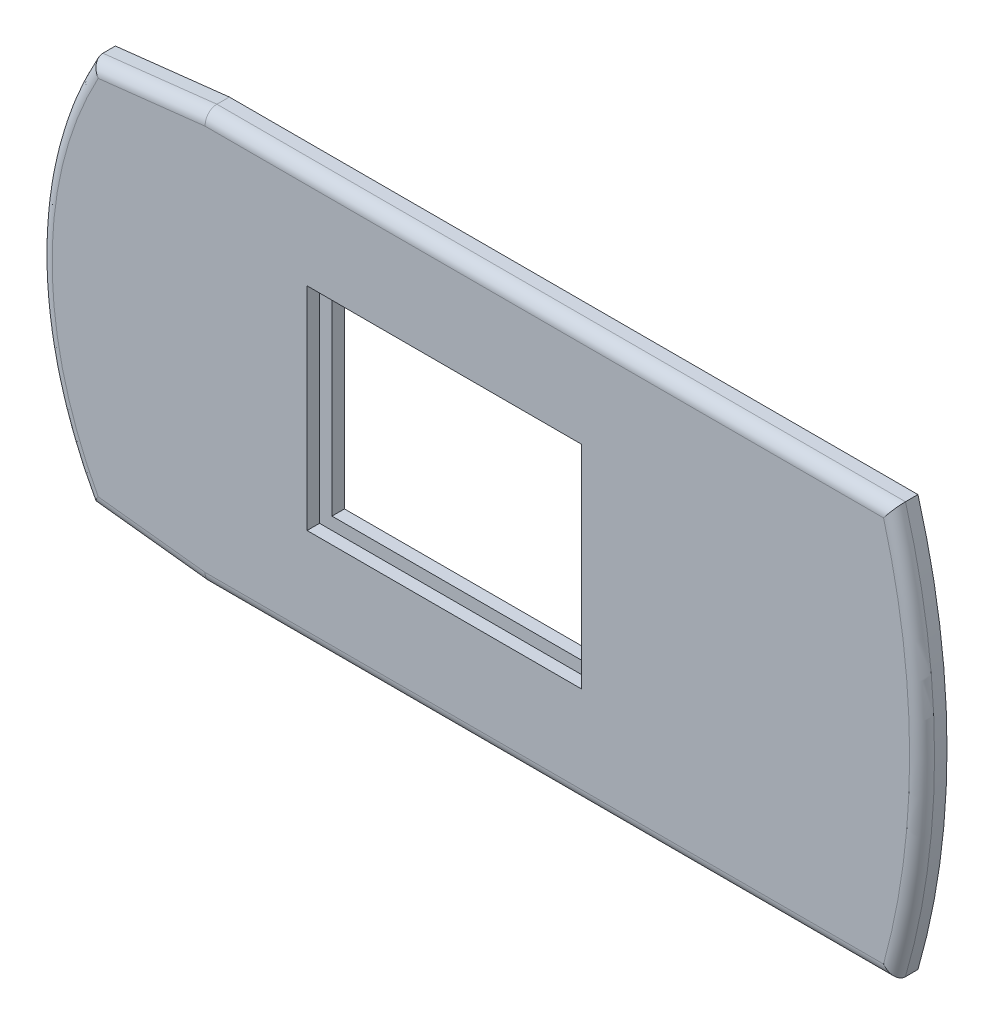
ISO-10303-21;
HEADER;
FILE_DESCRIPTION(('STEP AP214'),'2;1');
FILE_NAME('part.step','',(''),(''),'','','');
FILE_SCHEMA(('AUTOMOTIVE_DESIGN { 1 0 10303 214 1 1 1 1 }'));
ENDSEC;
DATA;
#1=APPLICATION_CONTEXT('core data for automotive mechanical design processes');
#2=APPLICATION_PROTOCOL_DEFINITION('international standard','automotive_design',2000,#1);
#3=PRODUCT_CONTEXT('',#1,'mechanical');
#4=PRODUCT('Part','Part','',(#3));
#5=PRODUCT_RELATED_PRODUCT_CATEGORY('part','',(#4));
#6=PRODUCT_DEFINITION_FORMATION('','',#4);
#7=PRODUCT_DEFINITION_CONTEXT('part definition',#1,'design');
#8=PRODUCT_DEFINITION('design','',#6,#7);
#9=PRODUCT_DEFINITION_SHAPE('','',#8);
#10=(LENGTH_UNIT() NAMED_UNIT(*) SI_UNIT(.MILLI.,.METRE.));
#11=(NAMED_UNIT(*) PLANE_ANGLE_UNIT() SI_UNIT($,.RADIAN.));
#12=(NAMED_UNIT(*) SI_UNIT($,.STERADIAN.) SOLID_ANGLE_UNIT());
#13=UNCERTAINTY_MEASURE_WITH_UNIT(LENGTH_MEASURE(1.E-05),#10,'distance_accuracy_value','');
#14=(GEOMETRIC_REPRESENTATION_CONTEXT(3) GLOBAL_UNCERTAINTY_ASSIGNED_CONTEXT((#13)) GLOBAL_UNIT_ASSIGNED_CONTEXT((#10,
#11,#12)) REPRESENTATION_CONTEXT('',''));
#15=CARTESIAN_POINT('',(0.,0.,0.));
#16=DIRECTION('',(0.,0.,1.));
#17=DIRECTION('',(1.,0.,0.));
#18=AXIS2_PLACEMENT_3D('',#15,#16,#17);
#19=CARTESIAN_POINT('',(0.,12.8449815277263,10.));
#20=DIRECTION('',(0.,1.,0.));
#21=DIRECTION('',(-1.,0.,0.));
#22=AXIS2_PLACEMENT_3D('',#19,#20,#21);
#23=PLANE('',#22);
#24=DIRECTION('',(0.,0.,-1.));
#25=VECTOR('',#24,1.);
#26=CARTESIAN_POINT('',(-107.169243918135,12.8449815277263,5.));
#27=LINE('',#26,#25);
#28=CARTESIAN_POINT('',(-107.169243918135,12.8449815277263,5.));
#29=VERTEX_POINT('',#28);
#30=CARTESIAN_POINT('',(-107.169243918135,12.8449815277263,0.));
#31=VERTEX_POINT('',#30);
#32=EDGE_CURVE('E716',#29,#31,#27,.T.);
#33=ORIENTED_EDGE('',*,*,#32,.T.);
#34=DIRECTION('',(1.,0.,0.));
#35=VECTOR('',#34,1.);
#36=CARTESIAN_POINT('',(0.,12.8449815277263,0.));
#37=LINE('',#36,#35);
#38=CARTESIAN_POINT('',(-7.16924391813531,12.8449815277263,0.));
#39=VERTEX_POINT('',#38);
#40=EDGE_CURVE('E726',#31,#39,#37,.T.);
#41=ORIENTED_EDGE('',*,*,#40,.T.);
#42=DIRECTION('',(0.,0.,-1.));
#43=VECTOR('',#42,1.);
#44=CARTESIAN_POINT('',(-7.16924391813531,12.8449815277263,5.));
#45=LINE('',#44,#43);
#46=CARTESIAN_POINT('',(-7.16924391813531,12.8449815277263,5.));
#47=VERTEX_POINT('',#46);
#48=EDGE_CURVE('E329',#47,#39,#45,.T.);
#49=ORIENTED_EDGE('',*,*,#48,.F.);
#50=DIRECTION('',(1.,0.,0.));
#51=VECTOR('',#50,1.);
#52=CARTESIAN_POINT('',(0.,12.8449815277263,5.));
#53=LINE('',#52,#51);
#54=CARTESIAN_POINT('',(-2.16924391813533,12.8449815277263,5.));
#55=VERTEX_POINT('',#54);
#56=EDGE_CURVE('E257',#47,#55,#53,.T.);
#57=ORIENTED_EDGE('',*,*,#56,.T.);
#58=DIRECTION('',(0.,0.,-1.));
#59=VECTOR('',#58,1.);
#60=CARTESIAN_POINT('',(-2.16924391813533,12.8449815277263,10.));
#61=LINE('',#60,#59);
#62=CARTESIAN_POINT('',(-2.16924391813533,12.8449815277263,10.));
#63=VERTEX_POINT('',#62);
#64=EDGE_CURVE('E256',#63,#55,#61,.T.);
#65=ORIENTED_EDGE('',*,*,#64,.F.);
#66=DIRECTION('',(1.,0.,0.));
#67=VECTOR('',#66,1.);
#68=CARTESIAN_POINT('',(0.,12.8449815277263,10.));
#69=LINE('',#68,#67);
#70=CARTESIAN_POINT('',(-112.169243918135,12.8449815277263,10.));
#71=VERTEX_POINT('',#70);
#72=EDGE_CURVE('E743',#71,#63,#69,.T.);
#73=ORIENTED_EDGE('',*,*,#72,.F.);
#74=DIRECTION('',(0.,0.,-1.));
#75=VECTOR('',#74,1.);
#76=CARTESIAN_POINT('',(-112.169243918135,12.8449815277263,10.));
#77=LINE('',#76,#75);
#78=CARTESIAN_POINT('',(-112.169243918135,12.8449815277263,5.));
#79=VERTEX_POINT('',#78);
#80=EDGE_CURVE('E269',#71,#79,#77,.T.);
#81=ORIENTED_EDGE('',*,*,#80,.T.);
#82=EDGE_CURVE('E728',#79,#29,#53,.T.);
#83=ORIENTED_EDGE('',*,*,#82,.T.);
#84=EDGE_LOOP('',(#33,#41,#49,#57,#65,#73,#81,#83));
#85=FACE_BOUND('',#84,.T.);
#86=ADVANCED_FACE('F113',(#85),#23,.F.);
#87=CARTESIAN_POINT('',(-162.842918543589,-29.6550184722738,10.));
#88=DIRECTION('',(0.,0.,1.));
#89=DIRECTION('',(1.,0.,0.));
#90=AXIS2_PLACEMENT_3D('',#87,#88,#89);
#91=PLANE('',#90);
#92=DIRECTION('',(0.993731316158802,0.111794773067865,0.));
#93=VECTOR('',#92,1.);
#94=CARTESIAN_POINT('',(-171.330387782105,45.7891525367555,10.));
#95=LINE('',#94,#93);
#96=CARTESIAN_POINT('',(-153.056352306809,47.8449815277263,10.));
#97=VERTEX_POINT('',#96);
#98=CARTESIAN_POINT('',(-195.950945707795,43.0193397701153,10.));
#99=VERTEX_POINT('',#98);
#100=EDGE_CURVE('E310',#97,#99,#95,.F.);
#101=ORIENTED_EDGE('',*,*,#100,.T.);
#102=CARTESIAN_POINT('',(-62.3678470078131,-29.6550184722737,10.));
#103=DIRECTION('',(0.,0.,1.));
#104=DIRECTION('',(1.,0.,0.));
#105=AXIS2_PLACEMENT_3D('',#102,#103,#104);
#106=CIRCLE('',#105,152.072372915767);
#107=CARTESIAN_POINT('',(-195.950945707795,-102.329376714663,10.));
#108=VERTEX_POINT('',#107);
#109=EDGE_CURVE('E312',#99,#108,#106,.T.);
#110=ORIENTED_EDGE('',*,*,#109,.T.);
#111=DIRECTION('',(0.993731316158802,-0.111794773067865,0.));
#112=VECTOR('',#111,1.);
#113=CARTESIAN_POINT('',(-152.777744136089,-107.18636189148,10.));
#114=LINE('',#113,#112);
#115=CARTESIAN_POINT('',(-153.056352306809,-107.155018472274,10.));
#116=VERTEX_POINT('',#115);
#117=EDGE_CURVE('E302',#108,#116,#114,.T.);
#118=ORIENTED_EDGE('',*,*,#117,.T.);
#119=DIRECTION('',(1.,0.,0.));
#120=VECTOR('',#119,1.);
#121=CARTESIAN_POINT('',(122.846559314898,-107.155018472274,10.));
#122=LINE('',#121,#120);
#123=CARTESIAN_POINT('',(119.061051269534,-107.155018472274,10.));
#124=VERTEX_POINT('',#123);
#125=EDGE_CURVE('E304',#116,#124,#122,.T.);
#126=ORIENTED_EDGE('',*,*,#125,.T.);
#127=CARTESIAN_POINT('',(-162.842918543589,-29.6550184722738,10.));
#128=DIRECTION('',(0.,0.,1.));
#129=DIRECTION('',(1.,0.,0.));
#130=AXIS2_PLACEMENT_3D('',#127,#128,#129);
#131=CIRCLE('',#130,292.362956265663);
#132=CARTESIAN_POINT('',(119.061051269534,47.8449815277263,10.));
#133=VERTEX_POINT('',#132);
#134=EDGE_CURVE('E306',#124,#133,#131,.T.);
#135=ORIENTED_EDGE('',*,*,#134,.T.);
#136=DIRECTION('',(1.,0.,0.));
#137=VECTOR('',#136,1.);
#138=CARTESIAN_POINT('',(-162.842918543589,47.8449815277263,10.));
#139=LINE('',#138,#137);
#140=EDGE_CURVE('E308',#133,#97,#139,.F.);
#141=ORIENTED_EDGE('',*,*,#140,.T.);
#142=EDGE_LOOP('',(#101,#110,#118,#126,#135,#141));
#143=FACE_BOUND('',#142,.T.);
#144=DIRECTION('',(0.,1.,0.));
#145=VECTOR('',#144,1.);
#146=CARTESIAN_POINT('',(-2.16924391813533,0.,10.));
#147=LINE('',#146,#145);
#148=CARTESIAN_POINT('',(-2.16924391813531,-72.1550184722737,10.));
#149=VERTEX_POINT('',#148);
#150=EDGE_CURVE('E734',#149,#63,#147,.T.);
#151=ORIENTED_EDGE('',*,*,#150,.F.);
#152=DIRECTION('',(1.,0.,0.));
#153=VECTOR('',#152,1.);
#154=CARTESIAN_POINT('',(0.,-72.1550184722737,10.));
#155=LINE('',#154,#153);
#156=CARTESIAN_POINT('',(-112.169243918135,-72.1550184722737,10.));
#157=VERTEX_POINT('',#156);
#158=EDGE_CURVE('E262',#157,#149,#155,.T.);
#159=ORIENTED_EDGE('',*,*,#158,.F.);
#160=DIRECTION('',(0.,1.,0.));
#161=VECTOR('',#160,1.);
#162=CARTESIAN_POINT('',(-112.169243918135,0.,10.));
#163=LINE('',#162,#161);
#164=EDGE_CURVE('E748',#157,#71,#163,.T.);
#165=ORIENTED_EDGE('',*,*,#164,.T.);
#166=ORIENTED_EDGE('',*,*,#72,.T.);
#167=EDGE_LOOP('',(#151,#159,#165,#166));
#168=FACE_BOUND('',#167,.T.);
#169=ADVANCED_FACE('F379',(#143,#168),#91,.T.);
#170=CARTESIAN_POINT('',(-162.842918543589,-29.6550184722738,0.));
#171=DIRECTION('',(0.,0.,1.));
#172=DIRECTION('',(1.,0.,0.));
#173=AXIS2_PLACEMENT_3D('',#170,#171,#172);
#174=PLANE('',#173);
#175=ORIENTED_EDGE('',*,*,#40,.F.);
#176=DIRECTION('',(0.,1.,0.));
#177=VECTOR('',#176,1.);
#178=CARTESIAN_POINT('',(-107.169243918135,0.,0.));
#179=LINE('',#178,#177);
#180=CARTESIAN_POINT('',(-107.169243918135,-67.1550184722737,0.));
#181=VERTEX_POINT('',#180);
#182=EDGE_CURVE('E247',#181,#31,#179,.T.);
#183=ORIENTED_EDGE('',*,*,#182,.F.);
#184=DIRECTION('',(1.,0.,0.));
#185=VECTOR('',#184,1.);
#186=CARTESIAN_POINT('',(0.,-67.1550184722737,0.));
#187=LINE('',#186,#185);
#188=CARTESIAN_POINT('',(-7.16924391813531,-67.1550184722737,0.));
#189=VERTEX_POINT('',#188);
#190=EDGE_CURVE('E722',#181,#189,#187,.T.);
#191=ORIENTED_EDGE('',*,*,#190,.T.);
#192=DIRECTION('',(0.,1.,0.));
#193=VECTOR('',#192,1.);
#194=CARTESIAN_POINT('',(-7.16924391813531,0.,0.));
#195=LINE('',#194,#193);
#196=EDGE_CURVE('E733',#189,#39,#195,.T.);
#197=ORIENTED_EDGE('',*,*,#196,.T.);
#198=EDGE_LOOP('',(#175,#183,#191,#197));
#199=FACE_BOUND('',#198,.T.);
#200=CARTESIAN_POINT('',(-215.77598661219,-32.1550184722737,0.));
#201=DIRECTION('',(0.,0.,1.));
#202=DIRECTION('',(1.,0.,0.));
#203=AXIS2_PLACEMENT_3D('',#200,#201,#202);
#204=CIRCLE('',#203,2.5);
#205=CARTESIAN_POINT('',(-213.27598661219,-32.1550184722737,0.));
#206=VERTEX_POINT('',#205);
#207=EDGE_CURVE('E765',#206,#206,#204,.T.);
#208=ORIENTED_EDGE('',*,*,#207,.T.);
#209=EDGE_LOOP('',(#208));
#210=FACE_BOUND('',#209,.T.);
#211=CARTESIAN_POINT('',(-33.5490270948265,47.8449815277263,0.));
#212=DIRECTION('',(0.,0.,1.));
#213=DIRECTION('',(1.,0.,0.));
#214=AXIS2_PLACEMENT_3D('',#211,#212,#213);
#215=CIRCLE('',#214,2.5);
#216=CARTESIAN_POINT('',(-31.0490270948265,47.8449815277263,0.));
#217=VERTEX_POINT('',#216);
#218=EDGE_CURVE('E764',#217,#217,#215,.T.);
#219=ORIENTED_EDGE('',*,*,#218,.T.);
#220=EDGE_LOOP('',(#219));
#221=FACE_BOUND('',#220,.T.);
#222=CARTESIAN_POINT('',(-33.5490270948265,-107.155018472274,0.));
#223=DIRECTION('',(0.,0.,1.));
#224=DIRECTION('',(1.,0.,0.));
#225=AXIS2_PLACEMENT_3D('',#222,#223,#224);
#226=CIRCLE('',#225,2.5);
#227=CARTESIAN_POINT('',(-31.0490270948265,-107.155018472274,0.));
#228=VERTEX_POINT('',#227);
#229=EDGE_CURVE('E771',#228,#228,#226,.T.);
#230=ORIENTED_EDGE('',*,*,#229,.T.);
#231=EDGE_LOOP('',(#230));
#232=FACE_BOUND('',#231,.T.);
#233=CARTESIAN_POINT('',(130.22401338781,-32.1550184722737,0.));
#234=DIRECTION('',(0.,0.,1.));
#235=DIRECTION('',(1.,0.,0.));
#236=AXIS2_PLACEMENT_3D('',#233,#234,#235);
#237=CIRCLE('',#236,2.5);
#238=CARTESIAN_POINT('',(132.72401338781,-32.1550184722737,0.));
#239=VERTEX_POINT('',#238);
#240=EDGE_CURVE('E739',#239,#239,#237,.T.);
#241=ORIENTED_EDGE('',*,*,#240,.T.);
#242=EDGE_LOOP('',(#241));
#243=FACE_BOUND('',#242,.T.);
#244=DIRECTION('',(0.993731316158802,-0.111794773067865,0.));
#245=VECTOR('',#244,1.);
#246=CARTESIAN_POINT('',(-193.893934342868,-107.592331633862,0.));
#247=LINE('',#246,#245);
#248=CARTESIAN_POINT('',(-199.071776484503,-107.009824392928,0.));
#249=VERTEX_POINT('',#248);
#250=CARTESIAN_POINT('',(-153.336718001429,-112.155018472274,0.));
#251=VERTEX_POINT('',#250);
#252=EDGE_CURVE('E263',#249,#251,#247,.T.);
#253=ORIENTED_EDGE('',*,*,#252,.F.);
#254=CARTESIAN_POINT('',(-62.3678470078131,-29.6550184722737,0.));
#255=DIRECTION('',(0.,0.,1.));
#256=DIRECTION('',(1.,0.,0.));
#257=AXIS2_PLACEMENT_3D('',#254,#255,#256);
#258=CIRCLE('',#257,157.072372915767);
#259=CARTESIAN_POINT('',(-199.071776484503,47.6997874483803,0.));
#260=VERTEX_POINT('',#259);
#261=EDGE_CURVE('E284',#249,#260,#258,.F.);
#262=ORIENTED_EDGE('',*,*,#261,.T.);
#263=DIRECTION('',(0.993731316158802,0.111794773067865,0.));
#264=VECTOR('',#263,1.);
#265=CARTESIAN_POINT('',(-193.893934342868,48.2822946893143,0.));
#266=LINE('',#265,#264);
#267=CARTESIAN_POINT('',(-153.336718001428,52.8449815277263,0.));
#268=VERTEX_POINT('',#267);
#269=EDGE_CURVE('E281',#260,#268,#266,.T.);
#270=ORIENTED_EDGE('',*,*,#269,.T.);
#271=DIRECTION('',(1.,0.,0.));
#272=VECTOR('',#271,1.);
#273=CARTESIAN_POINT('',(-152.77598661219,52.8449815277263,0.));
#274=LINE('',#273,#272);
#275=CARTESIAN_POINT('',(122.846559314898,52.8449815277263,0.));
#276=VERTEX_POINT('',#275);
#277=EDGE_CURVE('E278',#268,#276,#274,.T.);
#278=ORIENTED_EDGE('',*,*,#277,.T.);
#279=CARTESIAN_POINT('',(-162.842918543589,-29.6550184722738,0.));
#280=DIRECTION('',(0.,0.,1.));
#281=DIRECTION('',(1.,0.,0.));
#282=AXIS2_PLACEMENT_3D('',#279,#280,#281);
#283=CIRCLE('',#282,297.362956265663);
#284=CARTESIAN_POINT('',(122.846559314898,-112.155018472274,0.));
#285=VERTEX_POINT('',#284);
#286=EDGE_CURVE('E275',#285,#276,#283,.T.);
#287=ORIENTED_EDGE('',*,*,#286,.F.);
#288=DIRECTION('',(1.,0.,0.));
#289=VECTOR('',#288,1.);
#290=CARTESIAN_POINT('',(-152.77598661219,-112.155018472274,0.));
#291=LINE('',#290,#289);
#292=EDGE_CURVE('E267',#251,#285,#291,.T.);
#293=ORIENTED_EDGE('',*,*,#292,.F.);
#294=EDGE_LOOP('',(#253,#262,#270,#278,#287,#293));
#295=FACE_BOUND('',#294,.T.);
#296=ADVANCED_FACE('F394',(#199,#210,#221,#232,#243,#295),#174,.F.);
#297=CARTESIAN_POINT('',(-193.893934342868,-107.592331633862,10.));
#298=DIRECTION('',(0.111794773067865,0.993731316158802,0.));
#299=DIRECTION('',(-0.993731316158802,0.111794773067865,0.));
#300=AXIS2_PLACEMENT_3D('',#297,#298,#299);
#301=PLANE('',#300);
#302=DIRECTION('',(0.,0.,-1.));
#303=VECTOR('',#302,1.);
#304=CARTESIAN_POINT('',(-153.336718001429,-112.155018472274,10.));
#305=LINE('',#304,#303);
#306=CARTESIAN_POINT('',(-153.336718001429,-112.155018472274,5.));
#307=VERTEX_POINT('',#306);
#308=EDGE_CURVE('E297',#307,#251,#305,.T.);
#309=ORIENTED_EDGE('',*,*,#308,.F.);
#310=DIRECTION('',(0.993731316158802,-0.111794773067865,0.));
#311=VECTOR('',#310,1.);
#312=CARTESIAN_POINT('',(-199.071776484503,-107.009824392928,5.));
#313=LINE('',#312,#311);
#314=CARTESIAN_POINT('',(-199.071776484503,-107.009824392928,5.));
#315=VERTEX_POINT('',#314);
#316=EDGE_CURVE('E12',#307,#315,#313,.F.);
#317=ORIENTED_EDGE('',*,*,#316,.T.);
#318=DIRECTION('',(0.,0.,-1.));
#319=VECTOR('',#318,1.);
#320=CARTESIAN_POINT('',(-199.071776484503,-107.009824392928,10.));
#321=LINE('',#320,#319);
#322=EDGE_CURVE('E287',#315,#249,#321,.T.);
#323=ORIENTED_EDGE('',*,*,#322,.T.);
#324=ORIENTED_EDGE('',*,*,#252,.T.);
#325=EDGE_LOOP('',(#309,#317,#323,#324));
#326=FACE_BOUND('',#325,.T.);
#327=ADVANCED_FACE('F398',(#326),#301,.F.);
#328=CARTESIAN_POINT('',(-152.77598661219,-112.155018472274,10.));
#329=DIRECTION('',(0.,1.,0.));
#330=DIRECTION('',(0.,0.,1.));
#331=AXIS2_PLACEMENT_3D('',#328,#329,#330);
#332=PLANE('',#331);
#333=DIRECTION('',(0.,0.,-1.));
#334=VECTOR('',#333,1.);
#335=CARTESIAN_POINT('',(122.846559314898,-112.155018472274,10.));
#336=LINE('',#335,#334);
#337=CARTESIAN_POINT('',(122.846559314898,-112.155018472274,5.));
#338=VERTEX_POINT('',#337);
#339=EDGE_CURVE('E295',#338,#285,#336,.T.);
#340=ORIENTED_EDGE('',*,*,#339,.F.);
#341=DIRECTION('',(1.,0.,0.));
#342=VECTOR('',#341,1.);
#343=CARTESIAN_POINT('',(-153.336718001429,-112.155018472274,5.));
#344=LINE('',#343,#342);
#345=EDGE_CURVE('E127',#338,#307,#344,.F.);
#346=ORIENTED_EDGE('',*,*,#345,.T.);
#347=ORIENTED_EDGE('',*,*,#308,.T.);
#348=ORIENTED_EDGE('',*,*,#292,.T.);
#349=EDGE_LOOP('',(#340,#346,#347,#348));
#350=FACE_BOUND('',#349,.T.);
#351=ADVANCED_FACE('F409',(#350),#332,.F.);
#352=CARTESIAN_POINT('',(-162.842918543589,-29.6550184722738,10.));
#353=DIRECTION('',(0.,0.,-1.));
#354=DIRECTION('',(-1.,0.,0.));
#355=AXIS2_PLACEMENT_3D('',#352,#353,#354);
#356=CYLINDRICAL_SURFACE('',#355,297.362956265663);
#357=DIRECTION('',(0.,0.,-1.));
#358=VECTOR('',#357,1.);
#359=CARTESIAN_POINT('',(122.846559314898,52.8449815277263,10.));
#360=LINE('',#359,#358);
#361=CARTESIAN_POINT('',(122.846559314898,52.8449815277263,5.));
#362=VERTEX_POINT('',#361);
#363=EDGE_CURVE('E293',#362,#276,#360,.T.);
#364=ORIENTED_EDGE('',*,*,#363,.F.);
#365=CARTESIAN_POINT('',(-162.842918543589,-29.6550184722738,5.));
#366=DIRECTION('',(0.,0.,1.));
#367=DIRECTION('',(1.,0.,0.));
#368=AXIS2_PLACEMENT_3D('',#365,#366,#367);
#369=CIRCLE('',#368,297.362956265663);
#370=EDGE_CURVE('E142',#362,#338,#369,.F.);
#371=ORIENTED_EDGE('',*,*,#370,.T.);
#372=ORIENTED_EDGE('',*,*,#339,.T.);
#373=ORIENTED_EDGE('',*,*,#286,.T.);
#374=EDGE_LOOP('',(#364,#371,#372,#373));
#375=FACE_BOUND('',#374,.T.);
#376=ADVANCED_FACE('F408',(#375),#356,.T.);
#377=CARTESIAN_POINT('',(-152.77598661219,52.8449815277263,10.));
#378=DIRECTION('',(0.,1.,0.));
#379=DIRECTION('',(0.,0.,1.));
#380=AXIS2_PLACEMENT_3D('',#377,#378,#379);
#381=PLANE('',#380);
#382=DIRECTION('',(0.,0.,-1.));
#383=VECTOR('',#382,1.);
#384=CARTESIAN_POINT('',(-153.336718001428,52.8449815277263,10.));
#385=LINE('',#384,#383);
#386=CARTESIAN_POINT('',(-153.336718001428,52.8449815277263,5.));
#387=VERTEX_POINT('',#386);
#388=EDGE_CURVE('E291',#387,#268,#385,.T.);
#389=ORIENTED_EDGE('',*,*,#388,.F.);
#390=DIRECTION('',(1.,0.,0.));
#391=VECTOR('',#390,1.);
#392=CARTESIAN_POINT('',(-152.77598661219,52.8449815277263,5.));
#393=LINE('',#392,#391);
#394=EDGE_CURVE('E317',#387,#362,#393,.T.);
#395=ORIENTED_EDGE('',*,*,#394,.T.);
#396=ORIENTED_EDGE('',*,*,#363,.T.);
#397=ORIENTED_EDGE('',*,*,#277,.F.);
#398=EDGE_LOOP('',(#389,#395,#396,#397));
#399=FACE_BOUND('',#398,.T.);
#400=ADVANCED_FACE('F407',(#399),#381,.T.);
#401=CARTESIAN_POINT('',(-193.893934342868,48.2822946893143,10.));
#402=DIRECTION('',(-0.111794773067865,0.993731316158802,0.));
#403=DIRECTION('',(-0.993731316158802,-0.111794773067865,0.));
#404=AXIS2_PLACEMENT_3D('',#401,#402,#403);
#405=PLANE('',#404);
#406=DIRECTION('',(0.,0.,-1.));
#407=VECTOR('',#406,1.);
#408=CARTESIAN_POINT('',(-199.071776484503,47.6997874483803,10.));
#409=LINE('',#408,#407);
#410=CARTESIAN_POINT('',(-199.071776484503,47.6997874483803,5.));
#411=VERTEX_POINT('',#410);
#412=EDGE_CURVE('E289',#411,#260,#409,.T.);
#413=ORIENTED_EDGE('',*,*,#412,.F.);
#414=DIRECTION('',(0.993731316158802,0.111794773067865,0.));
#415=VECTOR('',#414,1.);
#416=CARTESIAN_POINT('',(-193.893934342868,48.2822946893143,5.));
#417=LINE('',#416,#415);
#418=EDGE_CURVE('E315',#411,#387,#417,.T.);
#419=ORIENTED_EDGE('',*,*,#418,.T.);
#420=ORIENTED_EDGE('',*,*,#388,.T.);
#421=ORIENTED_EDGE('',*,*,#269,.F.);
#422=EDGE_LOOP('',(#413,#419,#420,#421));
#423=FACE_BOUND('',#422,.T.);
#424=ADVANCED_FACE('F390',(#423),#405,.T.);
#425=CARTESIAN_POINT('',(-62.3678470078131,-29.6550184722737,10.));
#426=DIRECTION('',(0.,0.,-1.));
#427=DIRECTION('',(-1.,0.,0.));
#428=AXIS2_PLACEMENT_3D('',#425,#426,#427);
#429=CYLINDRICAL_SURFACE('',#428,157.072372915767);
#430=ORIENTED_EDGE('',*,*,#322,.F.);
#431=CARTESIAN_POINT('',(-62.3678470078131,-29.6550184722737,5.));
#432=DIRECTION('',(0.,0.,1.));
#433=DIRECTION('',(1.,0.,0.));
#434=AXIS2_PLACEMENT_3D('',#431,#432,#433);
#435=CIRCLE('',#434,157.072372915767);
#436=EDGE_CURVE('E299',#315,#411,#435,.F.);
#437=ORIENTED_EDGE('',*,*,#436,.T.);
#438=ORIENTED_EDGE('',*,*,#412,.T.);
#439=ORIENTED_EDGE('',*,*,#261,.F.);
#440=EDGE_LOOP('',(#430,#437,#438,#439));
#441=FACE_BOUND('',#440,.T.);
#442=ADVANCED_FACE('F387',(#441),#429,.T.);
#443=CARTESIAN_POINT('',(0.,-72.1550184722737,10.));
#444=DIRECTION('',(0.,1.,0.));
#445=DIRECTION('',(-1.,0.,0.));
#446=AXIS2_PLACEMENT_3D('',#443,#444,#445);
#447=PLANE('',#446);
#448=DIRECTION('',(1.,0.,0.));
#449=VECTOR('',#448,1.);
#450=CARTESIAN_POINT('',(0.,-72.1550184722737,5.));
#451=LINE('',#450,#449);
#452=CARTESIAN_POINT('',(-112.169243918135,-72.1550184722737,5.));
#453=VERTEX_POINT('',#452);
#454=CARTESIAN_POINT('',(-2.16924391813531,-72.1550184722737,5.));
#455=VERTEX_POINT('',#454);
#456=EDGE_CURVE('E237',#453,#455,#451,.T.);
#457=ORIENTED_EDGE('',*,*,#456,.F.);
#458=DIRECTION('',(0.,0.,-1.));
#459=VECTOR('',#458,1.);
#460=CARTESIAN_POINT('',(-112.169243918135,-72.1550184722737,10.));
#461=LINE('',#460,#459);
#462=EDGE_CURVE('E264',#157,#453,#461,.T.);
#463=ORIENTED_EDGE('',*,*,#462,.F.);
#464=ORIENTED_EDGE('',*,*,#158,.T.);
#465=DIRECTION('',(0.,0.,-1.));
#466=VECTOR('',#465,1.);
#467=CARTESIAN_POINT('',(-2.16924391813531,-72.1550184722737,10.));
#468=LINE('',#467,#466);
#469=EDGE_CURVE('E253',#149,#455,#468,.T.);
#470=ORIENTED_EDGE('',*,*,#469,.T.);
#471=EDGE_LOOP('',(#457,#463,#464,#470));
#472=FACE_BOUND('',#471,.T.);
#473=ADVANCED_FACE('F260',(#472),#447,.T.);
#474=CARTESIAN_POINT('',(-112.169243918135,0.,10.));
#475=DIRECTION('',(-1.,0.,0.));
#476=DIRECTION('',(0.,0.,1.));
#477=AXIS2_PLACEMENT_3D('',#474,#475,#476);
#478=PLANE('',#477);
#479=ORIENTED_EDGE('',*,*,#462,.T.);
#480=DIRECTION('',(0.,1.,0.));
#481=VECTOR('',#480,1.);
#482=CARTESIAN_POINT('',(-112.169243918135,0.,5.));
#483=LINE('',#482,#481);
#484=EDGE_CURVE('E243',#453,#79,#483,.T.);
#485=ORIENTED_EDGE('',*,*,#484,.T.);
#486=ORIENTED_EDGE('',*,*,#80,.F.);
#487=ORIENTED_EDGE('',*,*,#164,.F.);
#488=EDGE_LOOP('',(#479,#485,#486,#487));
#489=FACE_BOUND('',#488,.T.);
#490=ADVANCED_FACE('F429',(#489),#478,.F.);
#491=CARTESIAN_POINT('',(-2.16924391813533,0.,10.));
#492=DIRECTION('',(-1.,0.,0.));
#493=DIRECTION('',(0.,-1.,0.));
#494=AXIS2_PLACEMENT_3D('',#491,#492,#493);
#495=PLANE('',#494);
#496=DIRECTION('',(0.,1.,0.));
#497=VECTOR('',#496,1.);
#498=CARTESIAN_POINT('',(-2.16924391813533,0.,5.));
#499=LINE('',#498,#497);
#500=EDGE_CURVE('E240',#455,#55,#499,.T.);
#501=ORIENTED_EDGE('',*,*,#500,.F.);
#502=ORIENTED_EDGE('',*,*,#469,.F.);
#503=ORIENTED_EDGE('',*,*,#150,.T.);
#504=ORIENTED_EDGE('',*,*,#64,.T.);
#505=EDGE_LOOP('',(#501,#502,#503,#504));
#506=FACE_BOUND('',#505,.T.);
#507=ADVANCED_FACE('F251',(#506),#495,.T.);
#508=CARTESIAN_POINT('',(130.22401338781,-32.1550184722737,5.));
#509=DIRECTION('',(0.,0.,-1.));
#510=DIRECTION('',(-1.,0.,0.));
#511=AXIS2_PLACEMENT_3D('',#508,#509,#510);
#512=CYLINDRICAL_SURFACE('',#511,2.5);
#513=CARTESIAN_POINT('',(130.22401338781,-32.1550184722737,5.));
#514=DIRECTION('',(0.,0.,1.));
#515=DIRECTION('',(1.,0.,0.));
#516=AXIS2_PLACEMENT_3D('',#513,#514,#515);
#517=CIRCLE('',#516,2.5);
#518=CARTESIAN_POINT('',(132.72401338781,-32.1550184722737,5.));
#519=VERTEX_POINT('',#518);
#520=EDGE_CURVE('E735',#519,#519,#517,.T.);
#521=ORIENTED_EDGE('',*,*,#520,.T.);
#522=EDGE_LOOP('',(#521));
#523=FACE_BOUND('',#522,.T.);
#524=ORIENTED_EDGE('',*,*,#240,.F.);
#525=EDGE_LOOP('',(#524));
#526=FACE_BOUND('',#525,.T.);
#527=ADVANCED_FACE('F427',(#523,#526),#512,.F.);
#528=CARTESIAN_POINT('',(0.,0.,5.));
#529=DIRECTION('',(0.,0.,1.));
#530=DIRECTION('',(1.,0.,0.));
#531=AXIS2_PLACEMENT_3D('',#528,#529,#530);
#532=PLANE('',#531);
#533=ORIENTED_EDGE('',*,*,#520,.F.);
#534=EDGE_LOOP('',(#533));
#535=FACE_BOUND('',#534,.T.);
#536=ADVANCED_FACE('F478',(#535),#532,.F.);
#537=CARTESIAN_POINT('',(-33.5490270948265,-107.155018472274,5.));
#538=DIRECTION('',(0.,0.,-1.));
#539=DIRECTION('',(-1.,0.,0.));
#540=AXIS2_PLACEMENT_3D('',#537,#538,#539);
#541=CYLINDRICAL_SURFACE('',#540,2.5);
#542=CARTESIAN_POINT('',(-33.5490270948265,-107.155018472274,5.));
#543=DIRECTION('',(0.,0.,1.));
#544=DIRECTION('',(1.,0.,0.));
#545=AXIS2_PLACEMENT_3D('',#542,#543,#544);
#546=CIRCLE('',#545,2.5);
#547=CARTESIAN_POINT('',(-31.0490270948265,-107.155018472274,5.));
#548=VERTEX_POINT('',#547);
#549=EDGE_CURVE('E774',#548,#548,#546,.T.);
#550=ORIENTED_EDGE('',*,*,#549,.T.);
#551=EDGE_LOOP('',(#550));
#552=FACE_BOUND('',#551,.T.);
#553=ORIENTED_EDGE('',*,*,#229,.F.);
#554=EDGE_LOOP('',(#553));
#555=FACE_BOUND('',#554,.T.);
#556=ADVANCED_FACE('F485',(#552,#555),#541,.F.);
#557=CARTESIAN_POINT('',(-33.5490270948265,-107.155018472274,5.));
#558=DIRECTION('',(0.,0.,1.));
#559=DIRECTION('',(1.,0.,0.));
#560=AXIS2_PLACEMENT_3D('',#557,#558,#559);
#561=PLANE('',#560);
#562=ORIENTED_EDGE('',*,*,#549,.F.);
#563=EDGE_LOOP('',(#562));
#564=FACE_BOUND('',#563,.T.);
#565=ADVANCED_FACE('F492',(#564),#561,.F.);
#566=CARTESIAN_POINT('',(-33.5490270948265,47.8449815277263,5.));
#567=DIRECTION('',(0.,0.,-1.));
#568=DIRECTION('',(-1.,0.,0.));
#569=AXIS2_PLACEMENT_3D('',#566,#567,#568);
#570=CYLINDRICAL_SURFACE('',#569,2.5);
#571=CARTESIAN_POINT('',(-33.5490270948265,47.8449815277263,5.));
#572=DIRECTION('',(0.,0.,1.));
#573=DIRECTION('',(1.,0.,0.));
#574=AXIS2_PLACEMENT_3D('',#571,#572,#573);
#575=CIRCLE('',#574,2.5);
#576=CARTESIAN_POINT('',(-31.0490270948265,47.8449815277263,5.));
#577=VERTEX_POINT('',#576);
#578=EDGE_CURVE('E768',#577,#577,#575,.T.);
#579=ORIENTED_EDGE('',*,*,#578,.T.);
#580=EDGE_LOOP('',(#579));
#581=FACE_BOUND('',#580,.T.);
#582=ORIENTED_EDGE('',*,*,#218,.F.);
#583=EDGE_LOOP('',(#582));
#584=FACE_BOUND('',#583,.T.);
#585=ADVANCED_FACE('F500',(#581,#584),#570,.F.);
#586=CARTESIAN_POINT('',(0.,0.,5.));
#587=DIRECTION('',(0.,0.,1.));
#588=DIRECTION('',(1.,0.,0.));
#589=AXIS2_PLACEMENT_3D('',#586,#587,#588);
#590=PLANE('',#589);
#591=ORIENTED_EDGE('',*,*,#578,.F.);
#592=EDGE_LOOP('',(#591));
#593=FACE_BOUND('',#592,.T.);
#594=ADVANCED_FACE('F508',(#593),#590,.F.);
#595=CARTESIAN_POINT('',(-215.77598661219,-32.1550184722737,5.));
#596=DIRECTION('',(0.,0.,-1.));
#597=DIRECTION('',(-1.,0.,0.));
#598=AXIS2_PLACEMENT_3D('',#595,#596,#597);
#599=CYLINDRICAL_SURFACE('',#598,2.5);
#600=CARTESIAN_POINT('',(-215.77598661219,-32.1550184722737,5.));
#601=DIRECTION('',(0.,0.,1.));
#602=DIRECTION('',(1.,0.,0.));
#603=AXIS2_PLACEMENT_3D('',#600,#601,#602);
#604=CIRCLE('',#603,2.5);
#605=CARTESIAN_POINT('',(-213.27598661219,-32.1550184722737,5.));
#606=VERTEX_POINT('',#605);
#607=EDGE_CURVE('E761',#606,#606,#604,.T.);
#608=ORIENTED_EDGE('',*,*,#607,.T.);
#609=EDGE_LOOP('',(#608));
#610=FACE_BOUND('',#609,.T.);
#611=ORIENTED_EDGE('',*,*,#207,.F.);
#612=EDGE_LOOP('',(#611));
#613=FACE_BOUND('',#612,.T.);
#614=ADVANCED_FACE('F516',(#610,#613),#599,.F.);
#615=CARTESIAN_POINT('',(0.,0.,5.));
#616=DIRECTION('',(0.,0.,1.));
#617=DIRECTION('',(1.,0.,0.));
#618=AXIS2_PLACEMENT_3D('',#615,#616,#617);
#619=PLANE('',#618);
#620=ORIENTED_EDGE('',*,*,#607,.F.);
#621=EDGE_LOOP('',(#620));
#622=FACE_BOUND('',#621,.T.);
#623=ADVANCED_FACE('F352',(#622),#619,.F.);
#624=CARTESIAN_POINT('',(-162.842918543589,-29.6550184722738,5.));
#625=DIRECTION('',(0.,0.,1.));
#626=DIRECTION('',(1.,0.,0.));
#627=AXIS2_PLACEMENT_3D('',#624,#625,#626);
#628=TOROIDAL_SURFACE('',#627,292.362956265663,5.);
#629=CARTESIAN_POINT('',(122.846559314898,52.8449815277263,5.));
#630=CARTESIAN_POINT('',(122.846578387997,52.8450071988912,5.12064129309682));
#631=CARTESIAN_POINT('',(122.843276343562,52.8406163793374,5.24126965179984));
#632=CARTESIAN_POINT('',(122.830172571386,52.8231935693022,5.48148772322463));
#633=CARTESIAN_POINT('',(122.82037403853,52.810165826344,5.60107791722883));
#634=CARTESIAN_POINT('',(122.794495286754,52.7757612769341,5.8376353354357));
#635=CARTESIAN_POINT('',(122.778452045214,52.7544336177054,5.95461379105829));
#636=CARTESIAN_POINT('',(122.740337339359,52.703770393566,6.18582275997962));
#637=CARTESIAN_POINT('',(122.718265418068,52.6744342216065,6.30005306425274));
#638=CARTESIAN_POINT('',(122.668459138384,52.6082455355814,6.52479849622029));
#639=CARTESIAN_POINT('',(122.640735634842,52.5714074304247,6.63532027982187));
#640=CARTESIAN_POINT('',(122.579971882867,52.4906805681694,6.85226829467733));
#641=CARTESIAN_POINT('',(122.546929570176,52.4467890736236,6.95869291584778));
#642=CARTESIAN_POINT('',(122.440358769649,52.3052549644103,7.27116409668724));
#643=CARTESIAN_POINT('',(122.359400839869,52.1977718955073,7.4703442013405));
#644=CARTESIAN_POINT('',(122.174853786941,51.9528866417955,7.86040539472484));
#645=CARTESIAN_POINT('',(122.070072274546,51.8139103362891,8.0497137898733));
#646=CARTESIAN_POINT('',(121.845580034671,51.5163459216676,8.40210144298199));
#647=CARTESIAN_POINT('',(121.725865748884,51.3577531382473,8.56517442806742));
#648=CARTESIAN_POINT('',(121.450767032832,50.9935679078088,8.89325317272324));
#649=CARTESIAN_POINT('',(121.292939808911,50.7847880729176,9.0526616311285));
#650=CARTESIAN_POINT('',(120.965297802057,50.3517620540545,9.33391630452648));
#651=CARTESIAN_POINT('',(120.795469617401,50.1274985858144,9.45571968375723));
#652=CARTESIAN_POINT('',(120.412039433034,49.6216470428355,9.68351929640491));
#653=CARTESIAN_POINT('',(120.196587499824,49.3377142438021,9.78119025893282));
#654=CARTESIAN_POINT('',(119.759415062183,48.7622710090596,9.9240553969083));
#655=CARTESIAN_POINT('',(119.537703572818,48.47077151533,9.96932145532003));
#656=CARTESIAN_POINT('',(119.233468315242,48.0712492392335,9.99603544711865));
#657=CARTESIAN_POINT('',(119.151637852136,47.9638362145062,9.99974087905556));
#658=CARTESIAN_POINT('',(119.066871457546,47.8526177757742,9.99999562514085));
#659=CARTESIAN_POINT('',(119.06396137805,47.8487996412797,9.99999999842433));
#660=CARTESIAN_POINT('',(119.061051269534,47.8449815277263,10.));
#661=B_SPLINE_CURVE_WITH_KNOTS('',3,(#629,#630,#631,#632,#633,#634,#635,#636,#637,#638,#639,
#640,#641,#642,#643,#644,#645,#646,#647,#648,#649,#650,#651,#652,#653,#654,#655,#656,#657,#658,
#659,#660),.UNSPECIFIED.,.F.,.F.,(4,2,2,2,2,2,2,2,2,2,2,2,2,2,2,4),(0.,0.361778523892222,
0.723379261797171,1.08287061750595,1.44238923039137,1.80122372310997,2.16019781869008,
2.87834808578491,3.64708130891903,4.41599806352997,5.3319993408396,6.24904021346042,
7.35360003879479,8.45664295529532,8.86175779089303,8.87615988865273),.UNSPECIFIED.);
#662=EDGE_CURVE('E356',#133,#362,#661,.F.);
#663=ORIENTED_EDGE('',*,*,#662,.F.);
#664=ORIENTED_EDGE('',*,*,#134,.F.);
#665=CARTESIAN_POINT('',(122.846559314898,-112.155018472274,5.));
#666=CARTESIAN_POINT('',(122.846578387997,-112.155044143439,5.12064129309682));
#667=CARTESIAN_POINT('',(122.843276343562,-112.150653323885,5.24126965179983));
#668=CARTESIAN_POINT('',(122.830172571386,-112.13323051385,5.48148772322462));
#669=CARTESIAN_POINT('',(122.82037403853,-112.120202770892,5.60107791722883));
#670=CARTESIAN_POINT('',(122.794495286754,-112.085798221482,5.8376353354357));
#671=CARTESIAN_POINT('',(122.778452045214,-112.064470562253,5.95461379105828));
#672=CARTESIAN_POINT('',(122.740337339359,-112.013807338113,6.18582275997962));
#673=CARTESIAN_POINT('',(122.718265418068,-111.984471166154,6.30005306425274));
#674=CARTESIAN_POINT('',(122.668459138384,-111.918282480129,6.52479849622029));
#675=CARTESIAN_POINT('',(122.640735634842,-111.881444374972,6.63532027982187));
#676=CARTESIAN_POINT('',(122.579971882867,-111.800717512717,6.85226829467732));
#677=CARTESIAN_POINT('',(122.546929570176,-111.756826018171,6.95869291584778));
#678=CARTESIAN_POINT('',(122.440358769649,-111.615291908958,7.27116409668724));
#679=CARTESIAN_POINT('',(122.359400839869,-111.507808840055,7.47034420134048));
#680=CARTESIAN_POINT('',(122.174853786941,-111.262923586343,7.86040539472483));
#681=CARTESIAN_POINT('',(122.070072274546,-111.123947280837,8.04971378987331));
#682=CARTESIAN_POINT('',(121.845580034671,-110.826382866215,8.402101442982));
#683=CARTESIAN_POINT('',(121.725865748884,-110.667790082795,8.56517442806741));
#684=CARTESIAN_POINT('',(121.450767032832,-110.303604852356,8.89325317272323));
#685=CARTESIAN_POINT('',(121.292939808911,-110.094825017465,9.05266163112851));
#686=CARTESIAN_POINT('',(120.965297802057,-109.661798998602,9.33391630452651));
#687=CARTESIAN_POINT('',(120.795469617401,-109.437535530362,9.45571968375724));
#688=CARTESIAN_POINT('',(120.412039433034,-108.931683987383,9.68351929640491));
#689=CARTESIAN_POINT('',(120.196587499824,-108.64775118835,9.78119025893282));
#690=CARTESIAN_POINT('',(119.759415062183,-108.072307953607,9.9240553969083));
#691=CARTESIAN_POINT('',(119.537703572818,-107.780808459877,9.96932145532003));
#692=CARTESIAN_POINT('',(119.233468315242,-107.381286183781,9.99603544711865));
#693=CARTESIAN_POINT('',(119.151637852135,-107.273873159054,9.99974087905556));
#694=CARTESIAN_POINT('',(119.066871457546,-107.162654720322,9.99999562514085));
#695=CARTESIAN_POINT('',(119.06396137805,-107.158836585827,9.99999999842433));
#696=CARTESIAN_POINT('',(119.061051269534,-107.155018472274,10.));
#697=B_SPLINE_CURVE_WITH_KNOTS('',3,(#665,#666,#667,#668,#669,#670,#671,#672,#673,#674,#675,
#676,#677,#678,#679,#680,#681,#682,#683,#684,#685,#686,#687,#688,#689,#690,#691,#692,#693,#694,
#695,#696),.UNSPECIFIED.,.F.,.F.,(4,2,2,2,2,2,2,2,2,2,2,2,2,2,2,4),(0.,0.361778523892219,
0.723379261797168,1.08287061750595,1.44238923039137,1.80122372310997,2.16019781869007,
2.87834808578492,3.64708130891904,4.41599806352999,5.33199934083962,6.24904021346043,
7.35360003879479,8.4566429552953,8.86175779089299,8.87615988865268),.UNSPECIFIED.);
#698=EDGE_CURVE('E118',#338,#124,#697,.T.);
#699=ORIENTED_EDGE('',*,*,#698,.F.);
#700=ORIENTED_EDGE('',*,*,#370,.F.);
#701=EDGE_LOOP('',(#663,#664,#699,#700));
#702=FACE_BOUND('',#701,.T.);
#703=ADVANCED_FACE('F349',(#702),#628,.T.);
#704=CARTESIAN_POINT('',(-162.842918543589,-107.155018472274,5.));
#705=DIRECTION('',(-1.,0.,0.));
#706=DIRECTION('',(0.,0.,1.));
#707=AXIS2_PLACEMENT_3D('',#704,#705,#706);
#708=CYLINDRICAL_SURFACE('',#707,5.);
#709=ORIENTED_EDGE('',*,*,#698,.T.);
#710=ORIENTED_EDGE('',*,*,#125,.F.);
#711=CARTESIAN_POINT('',(-153.056352306809,-107.155018472274,5.));
#712=DIRECTION('',(-0.998431599099007,0.0559851937622716,0.));
#713=DIRECTION('',(0.0559851937622714,0.998431599099007,0.));
#714=AXIS2_PLACEMENT_3D('',#711,#712,#713);
#715=ELLIPSE('',#714,5.0078543232326,5.);
#716=EDGE_CURVE('E362',#307,#116,#715,.T.);
#717=ORIENTED_EDGE('',*,*,#716,.F.);
#718=ORIENTED_EDGE('',*,*,#345,.F.);
#719=EDGE_LOOP('',(#709,#710,#717,#718));
#720=FACE_BOUND('',#719,.T.);
#721=ADVANCED_FACE('F115',(#720),#708,.T.);
#722=CARTESIAN_POINT('',(-152.77598661219,47.8449815277263,5.));
#723=DIRECTION('',(1.,0.,0.));
#724=DIRECTION('',(0.,0.,-1.));
#725=AXIS2_PLACEMENT_3D('',#722,#723,#724);
#726=CYLINDRICAL_SURFACE('',#725,5.);
#727=ORIENTED_EDGE('',*,*,#662,.T.);
#728=ORIENTED_EDGE('',*,*,#394,.F.);
#729=CARTESIAN_POINT('',(-153.056352306809,47.8449815277263,5.));
#730=DIRECTION('',(0.998431599099007,0.0559851937622717,0.));
#731=DIRECTION('',(0.0559851937622713,-0.998431599099007,0.));
#732=AXIS2_PLACEMENT_3D('',#729,#730,#731);
#733=ELLIPSE('',#732,5.0078543232326,5.);
#734=EDGE_CURVE('E364',#97,#387,#733,.F.);
#735=ORIENTED_EDGE('',*,*,#734,.F.);
#736=ORIENTED_EDGE('',*,*,#140,.F.);
#737=EDGE_LOOP('',(#727,#728,#735,#736));
#738=FACE_BOUND('',#737,.T.);
#739=ADVANCED_FACE('F347',(#738),#726,.T.);
#740=CARTESIAN_POINT('',(-171.330387782105,-105.099189481303,5.));
#741=DIRECTION('',(-0.993731316158802,0.111794773067865,0.));
#742=DIRECTION('',(-0.111794773067865,-0.993731316158802,0.));
#743=AXIS2_PLACEMENT_3D('',#740,#741,#742);
#744=CYLINDRICAL_SURFACE('',#743,5.);
#745=ORIENTED_EDGE('',*,*,#716,.T.);
#746=ORIENTED_EDGE('',*,*,#117,.F.);
#747=CARTESIAN_POINT('',(-199.071776484503,-107.009824392928,5.));
#748=CARTESIAN_POINT('',(-199.071789573402,-107.009844726117,5.12955594997669));
#749=CARTESIAN_POINT('',(-199.06866026342,-107.005108728782,5.25910397280869));
#750=CARTESIAN_POINT('',(-199.056213652034,-106.9862743878,5.51718426322276));
#751=CARTESIAN_POINT('',(-199.04689803412,-106.972178591254,5.64571679752506));
#752=CARTESIAN_POINT('',(-199.022219608612,-106.934841525252,5.90038273904326));
#753=CARTESIAN_POINT('',(-199.006878489674,-106.911633056748,6.02652306851536));
#754=CARTESIAN_POINT('',(-198.970328761598,-106.856349745279,6.27597718537728));
#755=CARTESIAN_POINT('',(-198.949119968238,-106.824274623936,6.39929088389039));
#756=CARTESIAN_POINT('',(-198.901084920163,-106.751645573631,6.64215684271275));
#757=CARTESIAN_POINT('',(-198.874263471978,-106.711098899531,6.76171222143089));
#758=CARTESIAN_POINT('',(-198.81527540989,-106.621949811265,6.99643654659233));
#759=CARTESIAN_POINT('',(-198.783106799621,-106.573344388376,7.11160383492432));
#760=CARTESIAN_POINT('',(-198.679023983596,-106.416129922168,7.44951826525553));
#761=CARTESIAN_POINT('',(-198.599512848636,-106.296092505934,7.6647775574979));
#762=CARTESIAN_POINT('',(-198.41939749918,-106.024402419376,8.07920333125496));
#763=CARTESIAN_POINT('',(-198.318036354615,-105.871616807327,8.27728720800262));
#764=CARTESIAN_POINT('',(-198.099767675163,-105.542946578519,8.64340087764242));
#765=CARTESIAN_POINT('',(-197.98285588902,-105.367055645357,8.81142242248638));
#766=CARTESIAN_POINT('',(-197.723940112893,-104.977962494964,9.13106082825648));
#767=CARTESIAN_POINT('',(-197.580591398884,-104.762782677818,9.27917589944141));
#768=CARTESIAN_POINT('',(-197.282810360743,-104.316389447904,9.53477947797785));
#769=CARTESIAN_POINT('',(-197.128368860809,-104.085162766855,9.642233879971));
#770=CARTESIAN_POINT('',(-196.806967891229,-103.604650948582,9.81855076518993));
#771=CARTESIAN_POINT('',(-196.639763198742,-103.355021308008,9.88601641588477));
#772=CARTESIAN_POINT('',(-196.301574423444,-102.850882930352,9.97630682457656));
#773=CARTESIAN_POINT('',(-196.130599270367,-102.596385878449,9.99922755556544));
#774=CARTESIAN_POINT('',(-195.956759769117,-102.338017508734,9.99999361404925));
#775=CARTESIAN_POINT('',(-195.9538527271,-102.333697038978,10.0000000128579));
#776=CARTESIAN_POINT('',(-195.950945707795,-102.329376714663,10.));
#777=B_SPLINE_CURVE_WITH_KNOTS('',3,(#747,#748,#749,#750,#751,#752,#753,#754,#755,#756,#757,
#758,#759,#760,#761,#762,#763,#764,#765,#766,#767,#768,#769,#770,#771,#772,#773,#774,#775,#776),
.UNSPECIFIED.,.F.,.F.,(4,2,2,2,2,2,2,2,2,2,2,2,2,2,4),(0.,0.388531206947267,0.776956725476181,
1.16399674271575,1.55104891286386,1.93777096824619,2.32463773221696,3.09805717482348,
3.90456803211599,4.71129982947476,5.60159165050933,6.49262858393136,7.41319221082833,
8.33177025503865,8.34739254539787),.UNSPECIFIED.);
#778=EDGE_CURVE('E328',#315,#108,#777,.T.);
#779=ORIENTED_EDGE('',*,*,#778,.F.);
#780=ORIENTED_EDGE('',*,*,#316,.F.);
#781=EDGE_LOOP('',(#745,#746,#779,#780));
#782=FACE_BOUND('',#781,.T.);
#783=ADVANCED_FACE('F343',(#782),#744,.T.);
#784=CARTESIAN_POINT('',(-193.334960477529,43.3136381085203,5.));
#785=DIRECTION('',(0.993731316158802,0.111794773067865,0.));
#786=DIRECTION('',(-0.111794773067865,0.993731316158802,0.));
#787=AXIS2_PLACEMENT_3D('',#784,#785,#786);
#788=CYLINDRICAL_SURFACE('',#787,5.);
#789=ORIENTED_EDGE('',*,*,#734,.T.);
#790=ORIENTED_EDGE('',*,*,#418,.F.);
#791=CARTESIAN_POINT('',(-199.071776484503,47.6997874483803,5.));
#792=CARTESIAN_POINT('',(-199.071789573402,47.6998077815696,5.12955594997669));
#793=CARTESIAN_POINT('',(-199.06866026342,47.6950717842343,5.2591039728087));
#794=CARTESIAN_POINT('',(-199.056213652034,47.6762374432526,5.51718426322276));
#795=CARTESIAN_POINT('',(-199.04689803412,47.662141646706,5.64571679752506));
#796=CARTESIAN_POINT('',(-199.022219608612,47.6248045807044,5.90038273904326));
#797=CARTESIAN_POINT('',(-199.006878489674,47.6015961122006,6.02652306851536));
#798=CARTESIAN_POINT('',(-198.970328761598,47.5463128007314,6.27597718537728));
#799=CARTESIAN_POINT('',(-198.949119968238,47.5142376793882,6.3992908838904));
#800=CARTESIAN_POINT('',(-198.901084920163,47.441608629083,6.64215684271276));
#801=CARTESIAN_POINT('',(-198.874263471978,47.4010619549839,6.7617122214309));
#802=CARTESIAN_POINT('',(-198.81527540989,47.3119128667177,6.99643654659236));
#803=CARTESIAN_POINT('',(-198.783106799621,47.2633074438284,7.11160383492435));
#804=CARTESIAN_POINT('',(-198.679023983596,47.1060929776203,7.44951826525555));
#805=CARTESIAN_POINT('',(-198.599512848636,46.9860555613863,7.66477755749792));
#806=CARTESIAN_POINT('',(-198.41939749918,46.7143654748287,8.07920333125497));
#807=CARTESIAN_POINT('',(-198.318036354615,46.561579862779,8.27728720800262));
#808=CARTESIAN_POINT('',(-198.099767675163,46.2329096339713,8.64340087764241));
#809=CARTESIAN_POINT('',(-197.98285588902,46.0570187008095,8.81142242248638));
#810=CARTESIAN_POINT('',(-197.723940112893,45.6679255504164,9.13106082825648));
#811=CARTESIAN_POINT('',(-197.580591398884,45.45274573327,9.2791758994414));
#812=CARTESIAN_POINT('',(-197.282810360743,45.0063525033565,9.53477947797785));
#813=CARTESIAN_POINT('',(-197.128368860809,44.7751258223073,9.642233879971));
#814=CARTESIAN_POINT('',(-196.806967891229,44.294614004034,9.81855076518993));
#815=CARTESIAN_POINT('',(-196.639763198743,44.0449843634595,9.88601641588477));
#816=CARTESIAN_POINT('',(-196.301574423443,43.5408459858056,9.97630682457657));
#817=CARTESIAN_POINT('',(-196.130599270363,43.2863489339037,9.99922755556544));
#818=CARTESIAN_POINT('',(-195.956759769117,43.0279805641867,9.99999361404925));
#819=CARTESIAN_POINT('',(-195.9538527271,43.0236600944302,10.0000000128579));
#820=CARTESIAN_POINT('',(-195.950945707795,43.0193397701153,10.));
#821=B_SPLINE_CURVE_WITH_KNOTS('',3,(#791,#792,#793,#794,#795,#796,#797,#798,#799,#800,#801,
#802,#803,#804,#805,#806,#807,#808,#809,#810,#811,#812,#813,#814,#815,#816,#817,#818,#819,#820),
.UNSPECIFIED.,.F.,.F.,(4,2,2,2,2,2,2,2,2,2,2,2,2,2,4),(0.,0.388531206947266,0.776956725476178,
1.16399674271575,1.55104891286386,1.93777096824621,2.32463773221699,3.09805717482349,
3.90456803211599,4.71129982947476,5.60159165050932,6.49262858393135,7.41319221082833,
8.33177025503867,8.34739254539787),.UNSPECIFIED.);
#822=EDGE_CURVE('E321',#99,#411,#821,.F.);
#823=ORIENTED_EDGE('',*,*,#822,.F.);
#824=ORIENTED_EDGE('',*,*,#100,.F.);
#825=EDGE_LOOP('',(#789,#790,#823,#824));
#826=FACE_BOUND('',#825,.T.);
#827=ADVANCED_FACE('F335',(#826),#788,.T.);
#828=CARTESIAN_POINT('',(-62.3678470078131,-29.6550184722737,5.));
#829=DIRECTION('',(0.,0.,1.));
#830=DIRECTION('',(1.,0.,0.));
#831=AXIS2_PLACEMENT_3D('',#828,#829,#830);
#832=TOROIDAL_SURFACE('',#831,152.072372915767,5.);
#833=ORIENTED_EDGE('',*,*,#778,.T.);
#834=ORIENTED_EDGE('',*,*,#109,.F.);
#835=ORIENTED_EDGE('',*,*,#822,.T.);
#836=ORIENTED_EDGE('',*,*,#436,.F.);
#837=EDGE_LOOP('',(#833,#834,#835,#836));
#838=FACE_BOUND('',#837,.T.);
#839=ADVANCED_FACE('F338',(#838),#832,.T.);
#840=CARTESIAN_POINT('',(-7.16924391813531,0.,5.));
#841=DIRECTION('',(-1.,0.,0.));
#842=DIRECTION('',(0.,0.,1.));
#843=AXIS2_PLACEMENT_3D('',#840,#841,#842);
#844=PLANE('',#843);
#845=ORIENTED_EDGE('',*,*,#196,.F.);
#846=DIRECTION('',(0.,0.,-1.));
#847=VECTOR('',#846,1.);
#848=CARTESIAN_POINT('',(-7.16924391813531,-67.1550184722737,5.));
#849=LINE('',#848,#847);
#850=CARTESIAN_POINT('',(-7.16924391813531,-67.1550184722737,5.));
#851=VERTEX_POINT('',#850);
#852=EDGE_CURVE('E758',#851,#189,#849,.T.);
#853=ORIENTED_EDGE('',*,*,#852,.F.);
#854=DIRECTION('',(0.,1.,0.));
#855=VECTOR('',#854,1.);
#856=CARTESIAN_POINT('',(-7.16924391813531,0.,5.));
#857=LINE('',#856,#855);
#858=EDGE_CURVE('E783',#851,#47,#857,.T.);
#859=ORIENTED_EDGE('',*,*,#858,.T.);
#860=ORIENTED_EDGE('',*,*,#48,.T.);
#861=EDGE_LOOP('',(#845,#853,#859,#860));
#862=FACE_BOUND('',#861,.T.);
#863=ADVANCED_FACE('F341',(#862),#844,.T.);
#864=CARTESIAN_POINT('',(0.,-67.1550184722737,5.));
#865=DIRECTION('',(0.,1.,0.));
#866=DIRECTION('',(0.,0.,1.));
#867=AXIS2_PLACEMENT_3D('',#864,#865,#866);
#868=PLANE('',#867);
#869=ORIENTED_EDGE('',*,*,#190,.F.);
#870=DIRECTION('',(0.,0.,-1.));
#871=VECTOR('',#870,1.);
#872=CARTESIAN_POINT('',(-107.169243918135,-67.1550184722737,5.));
#873=LINE('',#872,#871);
#874=CARTESIAN_POINT('',(-107.169243918135,-67.1550184722737,5.));
#875=VERTEX_POINT('',#874);
#876=EDGE_CURVE('E718',#875,#181,#873,.T.);
#877=ORIENTED_EDGE('',*,*,#876,.F.);
#878=DIRECTION('',(1.,0.,0.));
#879=VECTOR('',#878,1.);
#880=CARTESIAN_POINT('',(0.,-67.1550184722737,5.));
#881=LINE('',#880,#879);
#882=EDGE_CURVE('E784',#875,#851,#881,.T.);
#883=ORIENTED_EDGE('',*,*,#882,.T.);
#884=ORIENTED_EDGE('',*,*,#852,.T.);
#885=EDGE_LOOP('',(#869,#877,#883,#884));
#886=FACE_BOUND('',#885,.T.);
#887=ADVANCED_FACE('F564',(#886),#868,.T.);
#888=CARTESIAN_POINT('',(-107.169243918135,0.,5.));
#889=DIRECTION('',(-1.,0.,0.));
#890=DIRECTION('',(0.,0.,1.));
#891=AXIS2_PLACEMENT_3D('',#888,#889,#890);
#892=PLANE('',#891);
#893=ORIENTED_EDGE('',*,*,#182,.T.);
#894=ORIENTED_EDGE('',*,*,#32,.F.);
#895=DIRECTION('',(0.,1.,0.));
#896=VECTOR('',#895,1.);
#897=CARTESIAN_POINT('',(-107.169243918135,0.,5.));
#898=LINE('',#897,#896);
#899=EDGE_CURVE('E750',#875,#29,#898,.T.);
#900=ORIENTED_EDGE('',*,*,#899,.F.);
#901=ORIENTED_EDGE('',*,*,#876,.T.);
#902=EDGE_LOOP('',(#893,#894,#900,#901));
#903=FACE_BOUND('',#902,.T.);
#904=ADVANCED_FACE('F572',(#903),#892,.F.);
#905=CARTESIAN_POINT('',(0.,0.,5.));
#906=DIRECTION('',(0.,0.,1.));
#907=DIRECTION('',(1.,0.,0.));
#908=AXIS2_PLACEMENT_3D('',#905,#906,#907);
#909=PLANE('',#908);
#910=ORIENTED_EDGE('',*,*,#456,.T.);
#911=ORIENTED_EDGE('',*,*,#500,.T.);
#912=ORIENTED_EDGE('',*,*,#56,.F.);
#913=ORIENTED_EDGE('',*,*,#858,.F.);
#914=ORIENTED_EDGE('',*,*,#882,.F.);
#915=ORIENTED_EDGE('',*,*,#899,.T.);
#916=ORIENTED_EDGE('',*,*,#82,.F.);
#917=ORIENTED_EDGE('',*,*,#484,.F.);
#918=EDGE_LOOP('',(#910,#911,#912,#913,#914,#915,#916,#917));
#919=FACE_BOUND('',#918,.T.);
#920=ADVANCED_FACE('F239',(#919),#909,.T.);
#921=CLOSED_SHELL('',(#86,#169,#296,#327,#351,#376,#400,#424,#442,#473,#490,#507,#527,#536,#556,
#565,#585,#594,#614,#623,#703,#721,#739,#783,#827,#839,#863,#887,#904,#920));
#922=MANIFOLD_SOLID_BREP('B2',#921);
#923=ADVANCED_BREP_SHAPE_REPRESENTATION('',(#18,#922),#14);
#924=SHAPE_DEFINITION_REPRESENTATION(#9,#923);
ENDSEC;
END-ISO-10303-21;
